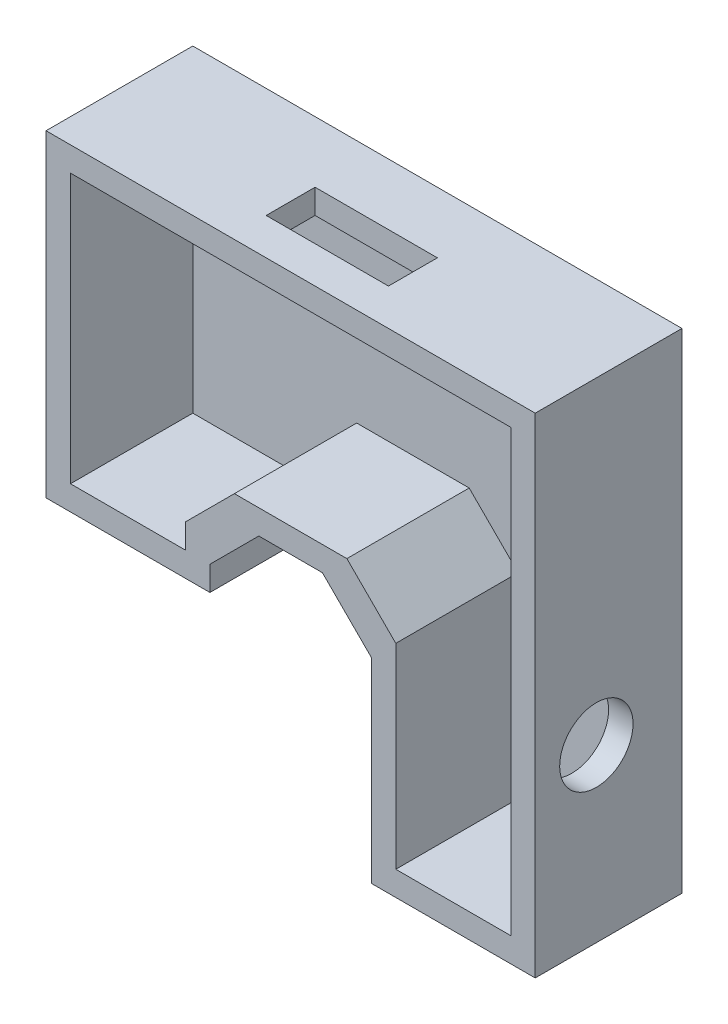
ISO-10303-21;
HEADER;
FILE_DESCRIPTION(('STEP AP214'),'2;1');
FILE_NAME('part.step','',(''),(''),'','','');
FILE_SCHEMA(('AUTOMOTIVE_DESIGN { 1 0 10303 214 1 1 1 1 }'));
ENDSEC;
DATA;
#1=APPLICATION_CONTEXT('core data for automotive mechanical design processes');
#2=APPLICATION_PROTOCOL_DEFINITION('international standard','automotive_design',2000,#1);
#3=PRODUCT_CONTEXT('',#1,'mechanical');
#4=PRODUCT('Part','Part','',(#3));
#5=PRODUCT_RELATED_PRODUCT_CATEGORY('part','',(#4));
#6=PRODUCT_DEFINITION_FORMATION('','',#4);
#7=PRODUCT_DEFINITION_CONTEXT('part definition',#1,'design');
#8=PRODUCT_DEFINITION('design','',#6,#7);
#9=PRODUCT_DEFINITION_SHAPE('','',#8);
#10=(LENGTH_UNIT() NAMED_UNIT(*) SI_UNIT(.MILLI.,.METRE.));
#11=(NAMED_UNIT(*) PLANE_ANGLE_UNIT() SI_UNIT($,.RADIAN.));
#12=(NAMED_UNIT(*) SI_UNIT($,.STERADIAN.) SOLID_ANGLE_UNIT());
#13=UNCERTAINTY_MEASURE_WITH_UNIT(LENGTH_MEASURE(1.E-05),#10,'distance_accuracy_value','');
#14=(GEOMETRIC_REPRESENTATION_CONTEXT(3) GLOBAL_UNCERTAINTY_ASSIGNED_CONTEXT((#13)) GLOBAL_UNIT_ASSIGNED_CONTEXT((#10,
#11,#12)) REPRESENTATION_CONTEXT('',''));
#15=CARTESIAN_POINT('',(0.,0.,0.));
#16=DIRECTION('',(0.,0.,1.));
#17=DIRECTION('',(1.,0.,0.));
#18=AXIS2_PLACEMENT_3D('',#15,#16,#17);
#19=CARTESIAN_POINT('',(0.,0.,12.5));
#20=DIRECTION('',(0.,0.,1.));
#21=DIRECTION('',(1.,0.,0.));
#22=AXIS2_PLACEMENT_3D('',#19,#20,#21);
#23=PLANE('',#22);
#24=DIRECTION('',(0.,-1.,0.));
#25=VECTOR('',#24,1.);
#26=CARTESIAN_POINT('',(-50.,-15.,12.5));
#27=LINE('',#26,#25);
#28=CARTESIAN_POINT('',(-50.,50.,12.5));
#29=VERTEX_POINT('',#28);
#30=CARTESIAN_POINT('',(-50.,-15.,12.5));
#31=VERTEX_POINT('',#30);
#32=EDGE_CURVE('E370',#29,#31,#27,.T.);
#33=ORIENTED_EDGE('',*,*,#32,.T.);
#34=DIRECTION('',(1.,0.,0.));
#35=VECTOR('',#34,1.);
#36=CARTESIAN_POINT('',(-50.,-15.,12.5));
#37=LINE('',#36,#35);
#38=CARTESIAN_POINT('',(-16.5,-15.,12.5));
#39=VERTEX_POINT('',#38);
#40=EDGE_CURVE('E374',#31,#39,#37,.T.);
#41=ORIENTED_EDGE('',*,*,#40,.T.);
#42=DIRECTION('',(0.,1.,0.));
#43=VECTOR('',#42,1.);
#44=CARTESIAN_POINT('',(-16.5,-15.,12.5));
#45=LINE('',#44,#43);
#46=CARTESIAN_POINT('',(-16.5,-9.99999999999995,12.5));
#47=VERTEX_POINT('',#46);
#48=EDGE_CURVE('E377',#39,#47,#45,.T.);
#49=ORIENTED_EDGE('',*,*,#48,.T.);
#50=DIRECTION('',(-0.707106781186551,-0.707106781186544,0.));
#51=VECTOR('',#50,1.);
#52=CARTESIAN_POINT('',(-6.49999999999993,0.,12.5));
#53=LINE('',#52,#51);
#54=CARTESIAN_POINT('',(-6.49999999999993,0.,12.5));
#55=VERTEX_POINT('',#54);
#56=EDGE_CURVE('E436',#47,#55,#53,.F.);
#57=ORIENTED_EDGE('',*,*,#56,.T.);
#58=DIRECTION('',(1.,0.,0.));
#59=VECTOR('',#58,1.);
#60=CARTESIAN_POINT('',(-16.5,0.,12.5));
#61=LINE('',#60,#59);
#62=CARTESIAN_POINT('',(6.50000000000007,0.,12.5));
#63=VERTEX_POINT('',#62);
#64=EDGE_CURVE('E381',#55,#63,#61,.T.);
#65=ORIENTED_EDGE('',*,*,#64,.T.);
#66=DIRECTION('',(-0.707106781186544,0.707106781186551,0.));
#67=VECTOR('',#66,1.);
#68=CARTESIAN_POINT('',(16.5000000000001,-10.0000000000001,12.5));
#69=LINE('',#68,#67);
#70=CARTESIAN_POINT('',(16.5,-10.0000000000001,12.5));
#71=VERTEX_POINT('',#70);
#72=EDGE_CURVE('E442',#63,#71,#69,.F.);
#73=ORIENTED_EDGE('',*,*,#72,.T.);
#74=DIRECTION('',(0.,-1.,0.));
#75=VECTOR('',#74,1.);
#76=CARTESIAN_POINT('',(16.5,-45.,12.5));
#77=LINE('',#76,#75);
#78=CARTESIAN_POINT('',(16.5,-50.,12.5));
#79=VERTEX_POINT('',#78);
#80=EDGE_CURVE('E385',#71,#79,#77,.T.);
#81=ORIENTED_EDGE('',*,*,#80,.T.);
#82=DIRECTION('',(1.,0.,0.));
#83=VECTOR('',#82,1.);
#84=CARTESIAN_POINT('',(50.,-50.,12.5));
#85=LINE('',#84,#83);
#86=CARTESIAN_POINT('',(50.,-50.,12.5));
#87=VERTEX_POINT('',#86);
#88=EDGE_CURVE('E388',#79,#87,#85,.T.);
#89=ORIENTED_EDGE('',*,*,#88,.T.);
#90=DIRECTION('',(0.,1.,0.));
#91=VECTOR('',#90,1.);
#92=CARTESIAN_POINT('',(50.,-50.,12.5));
#93=LINE('',#92,#91);
#94=CARTESIAN_POINT('',(50.,50.,12.5));
#95=VERTEX_POINT('',#94);
#96=EDGE_CURVE('E391',#87,#95,#93,.T.);
#97=ORIENTED_EDGE('',*,*,#96,.T.);
#98=DIRECTION('',(-1.,0.,0.));
#99=VECTOR('',#98,1.);
#100=CARTESIAN_POINT('',(50.,50.,12.5));
#101=LINE('',#100,#99);
#102=EDGE_CURVE('E394',#95,#29,#101,.T.);
#103=ORIENTED_EDGE('',*,*,#102,.T.);
#104=EDGE_LOOP('',(#33,#41,#49,#57,#65,#73,#81,#89,#97,#103));
#105=FACE_BOUND('',#104,.T.);
#106=DIRECTION('',(0.,-1.,0.));
#107=VECTOR('',#106,1.);
#108=CARTESIAN_POINT('',(21.5,-45.,12.5));
#109=LINE('',#108,#107);
#110=CARTESIAN_POINT('',(21.5,-5.00000000000005,12.5));
#111=VERTEX_POINT('',#110);
#112=CARTESIAN_POINT('',(21.5,-45.,12.5));
#113=VERTEX_POINT('',#112);
#114=EDGE_CURVE('E318',#111,#113,#109,.T.);
#115=ORIENTED_EDGE('',*,*,#114,.F.);
#116=DIRECTION('',(0.707106781186546,-0.707106781186549,0.));
#117=VECTOR('',#116,1.);
#118=CARTESIAN_POINT('',(8.25000000000003,8.25,12.5));
#119=LINE('',#118,#117);
#120=CARTESIAN_POINT('',(11.5,5.,12.5));
#121=VERTEX_POINT('',#120);
#122=EDGE_CURVE('E457',#111,#121,#119,.F.);
#123=ORIENTED_EDGE('',*,*,#122,.T.);
#124=DIRECTION('',(1.,0.,0.));
#125=VECTOR('',#124,1.);
#126=CARTESIAN_POINT('',(21.5,5.,12.5));
#127=LINE('',#126,#125);
#128=CARTESIAN_POINT('',(-11.5,5.,12.5));
#129=VERTEX_POINT('',#128);
#130=EDGE_CURVE('E314',#129,#121,#127,.T.);
#131=ORIENTED_EDGE('',*,*,#130,.F.);
#132=DIRECTION('',(0.707106781186549,0.707106781186546,0.));
#133=VECTOR('',#132,1.);
#134=CARTESIAN_POINT('',(-8.24999999999996,8.24999999999998,12.5));
#135=LINE('',#134,#133);
#136=CARTESIAN_POINT('',(-21.5,-5.00000000000001,12.5));
#137=VERTEX_POINT('',#136);
#138=EDGE_CURVE('E64',#129,#137,#135,.F.);
#139=ORIENTED_EDGE('',*,*,#138,.T.);
#140=DIRECTION('',(0.,1.,0.));
#141=VECTOR('',#140,1.);
#142=CARTESIAN_POINT('',(-21.5,-10.,12.5));
#143=LINE('',#142,#141);
#144=CARTESIAN_POINT('',(-21.5,-10.,12.5));
#145=VERTEX_POINT('',#144);
#146=EDGE_CURVE('E311',#145,#137,#143,.T.);
#147=ORIENTED_EDGE('',*,*,#146,.F.);
#148=DIRECTION('',(1.,0.,0.));
#149=VECTOR('',#148,1.);
#150=CARTESIAN_POINT('',(-21.5,-10.,12.5));
#151=LINE('',#150,#149);
#152=CARTESIAN_POINT('',(-45.,-10.,12.5));
#153=VERTEX_POINT('',#152);
#154=EDGE_CURVE('E308',#153,#145,#151,.T.);
#155=ORIENTED_EDGE('',*,*,#154,.F.);
#156=DIRECTION('',(0.,-1.,0.));
#157=VECTOR('',#156,1.);
#158=CARTESIAN_POINT('',(-45.,-10.,12.5));
#159=LINE('',#158,#157);
#160=CARTESIAN_POINT('',(-45.,45.,12.5));
#161=VERTEX_POINT('',#160);
#162=EDGE_CURVE('E305',#161,#153,#159,.T.);
#163=ORIENTED_EDGE('',*,*,#162,.F.);
#164=DIRECTION('',(-1.,0.,0.));
#165=VECTOR('',#164,1.);
#166=CARTESIAN_POINT('',(45.,45.,12.5));
#167=LINE('',#166,#165);
#168=CARTESIAN_POINT('',(45.,45.,12.5));
#169=VERTEX_POINT('',#168);
#170=EDGE_CURVE('E302',#169,#161,#167,.T.);
#171=ORIENTED_EDGE('',*,*,#170,.F.);
#172=DIRECTION('',(0.,1.,0.));
#173=VECTOR('',#172,1.);
#174=CARTESIAN_POINT('',(45.,-45.,12.5));
#175=LINE('',#174,#173);
#176=CARTESIAN_POINT('',(45.,-45.,12.5));
#177=VERTEX_POINT('',#176);
#178=EDGE_CURVE('E298',#177,#169,#175,.T.);
#179=ORIENTED_EDGE('',*,*,#178,.F.);
#180=DIRECTION('',(1.,0.,0.));
#181=VECTOR('',#180,1.);
#182=CARTESIAN_POINT('',(45.,-45.,12.5));
#183=LINE('',#182,#181);
#184=EDGE_CURVE('E295',#113,#177,#183,.T.);
#185=ORIENTED_EDGE('',*,*,#184,.F.);
#186=EDGE_LOOP('',(#115,#123,#131,#139,#147,#155,#163,#171,#179,#185));
#187=FACE_BOUND('',#186,.T.);
#188=ADVANCED_FACE('F41',(#105,#187),#23,.T.);
#189=CARTESIAN_POINT('',(-50.,-15.,12.5));
#190=DIRECTION('',(1.,0.,0.));
#191=DIRECTION('',(0.,0.,-1.));
#192=AXIS2_PLACEMENT_3D('',#189,#190,#191);
#193=PLANE('',#192);
#194=DIRECTION('',(0.,0.,-1.));
#195=VECTOR('',#194,1.);
#196=CARTESIAN_POINT('',(-50.,50.,12.5));
#197=LINE('',#196,#195);
#198=CARTESIAN_POINT('',(-50.,50.,-17.5));
#199=VERTEX_POINT('',#198);
#200=EDGE_CURVE('E397',#29,#199,#197,.T.);
#201=ORIENTED_EDGE('',*,*,#200,.T.);
#202=DIRECTION('',(0.,1.,0.));
#203=VECTOR('',#202,1.);
#204=CARTESIAN_POINT('',(-50.,50.,-17.5));
#205=LINE('',#204,#203);
#206=CARTESIAN_POINT('',(-50.,-15.,-17.5));
#207=VERTEX_POINT('',#206);
#208=EDGE_CURVE('E267',#207,#199,#205,.T.);
#209=ORIENTED_EDGE('',*,*,#208,.F.);
#210=DIRECTION('',(0.,0.,-1.));
#211=VECTOR('',#210,1.);
#212=CARTESIAN_POINT('',(-50.,-15.,12.5));
#213=LINE('',#212,#211);
#214=EDGE_CURVE('E413',#31,#207,#213,.T.);
#215=ORIENTED_EDGE('',*,*,#214,.F.);
#216=ORIENTED_EDGE('',*,*,#32,.F.);
#217=EDGE_LOOP('',(#201,#209,#215,#216));
#218=FACE_BOUND('',#217,.T.);
#219=ADVANCED_FACE('F517',(#218),#193,.F.);
#220=CARTESIAN_POINT('',(-50.,-15.,12.5));
#221=DIRECTION('',(0.,1.,0.));
#222=DIRECTION('',(0.,0.,1.));
#223=AXIS2_PLACEMENT_3D('',#220,#221,#222);
#224=PLANE('',#223);
#225=ORIENTED_EDGE('',*,*,#214,.T.);
#226=DIRECTION('',(-1.,0.,0.));
#227=VECTOR('',#226,1.);
#228=CARTESIAN_POINT('',(-16.5,-15.,-17.5));
#229=LINE('',#228,#227);
#230=CARTESIAN_POINT('',(-16.5,-15.,-17.5));
#231=VERTEX_POINT('',#230);
#232=EDGE_CURVE('E258',#231,#207,#229,.T.);
#233=ORIENTED_EDGE('',*,*,#232,.F.);
#234=DIRECTION('',(0.,0.,-1.));
#235=VECTOR('',#234,1.);
#236=CARTESIAN_POINT('',(-16.5,-15.,12.5));
#237=LINE('',#236,#235);
#238=EDGE_CURVE('E409',#39,#231,#237,.T.);
#239=ORIENTED_EDGE('',*,*,#238,.F.);
#240=ORIENTED_EDGE('',*,*,#40,.F.);
#241=EDGE_LOOP('',(#225,#233,#239,#240));
#242=FACE_BOUND('',#241,.T.);
#243=ADVANCED_FACE('F522',(#242),#224,.F.);
#244=CARTESIAN_POINT('',(-16.5,-15.,12.5));
#245=DIRECTION('',(-1.,0.,0.));
#246=DIRECTION('',(0.,-1.,0.));
#247=AXIS2_PLACEMENT_3D('',#244,#245,#246);
#248=PLANE('',#247);
#249=DIRECTION('',(0.,-1.,0.));
#250=VECTOR('',#249,1.);
#251=CARTESIAN_POINT('',(-16.5,0.,-17.5));
#252=LINE('',#251,#250);
#253=CARTESIAN_POINT('',(-16.5,-9.99999999999995,-17.5));
#254=VERTEX_POINT('',#253);
#255=EDGE_CURVE('E291',#254,#231,#252,.T.);
#256=ORIENTED_EDGE('',*,*,#255,.F.);
#257=DIRECTION('',(0.,0.,1.));
#258=VECTOR('',#257,1.);
#259=CARTESIAN_POINT('',(-16.5,-9.99999999999995,12.5));
#260=LINE('',#259,#258);
#261=EDGE_CURVE('E426',#254,#47,#260,.T.);
#262=ORIENTED_EDGE('',*,*,#261,.T.);
#263=ORIENTED_EDGE('',*,*,#48,.F.);
#264=ORIENTED_EDGE('',*,*,#238,.T.);
#265=EDGE_LOOP('',(#256,#262,#263,#264));
#266=FACE_BOUND('',#265,.T.);
#267=ADVANCED_FACE('F540',(#266),#248,.F.);
#268=CARTESIAN_POINT('',(-16.5,0.,12.5));
#269=DIRECTION('',(0.,1.,0.));
#270=DIRECTION('',(0.,0.,1.));
#271=AXIS2_PLACEMENT_3D('',#268,#269,#270);
#272=PLANE('',#271);
#273=ORIENTED_EDGE('',*,*,#64,.F.);
#274=DIRECTION('',(0.,0.,-1.));
#275=VECTOR('',#274,1.);
#276=CARTESIAN_POINT('',(-6.49999999999993,0.,-17.5));
#277=LINE('',#276,#275);
#278=CARTESIAN_POINT('',(-6.49999999999993,0.,-17.5));
#279=VERTEX_POINT('',#278);
#280=EDGE_CURVE('E422',#55,#279,#277,.T.);
#281=ORIENTED_EDGE('',*,*,#280,.T.);
#282=DIRECTION('',(-1.,0.,0.));
#283=VECTOR('',#282,1.);
#284=CARTESIAN_POINT('',(16.5,0.,-17.5));
#285=LINE('',#284,#283);
#286=CARTESIAN_POINT('',(6.50000000000007,0.,-17.5));
#287=VERTEX_POINT('',#286);
#288=EDGE_CURVE('E287',#287,#279,#285,.T.);
#289=ORIENTED_EDGE('',*,*,#288,.F.);
#290=DIRECTION('',(0.,0.,1.));
#291=VECTOR('',#290,1.);
#292=CARTESIAN_POINT('',(6.50000000000007,0.,12.5));
#293=LINE('',#292,#291);
#294=EDGE_CURVE('E416',#287,#63,#293,.T.);
#295=ORIENTED_EDGE('',*,*,#294,.T.);
#296=EDGE_LOOP('',(#273,#281,#289,#295));
#297=FACE_BOUND('',#296,.T.);
#298=ADVANCED_FACE('F536',(#297),#272,.F.);
#299=CARTESIAN_POINT('',(16.5,-45.,12.5));
#300=DIRECTION('',(1.,0.,0.));
#301=DIRECTION('',(0.,1.,0.));
#302=AXIS2_PLACEMENT_3D('',#299,#300,#301);
#303=PLANE('',#302);
#304=ORIENTED_EDGE('',*,*,#80,.F.);
#305=DIRECTION('',(0.,0.,-1.));
#306=VECTOR('',#305,1.);
#307=CARTESIAN_POINT('',(16.5000000000001,-10.0000000000001,-17.5));
#308=LINE('',#307,#306);
#309=CARTESIAN_POINT('',(16.5,-10.0000000000001,-17.5));
#310=VERTEX_POINT('',#309);
#311=EDGE_CURVE('E429',#71,#310,#308,.T.);
#312=ORIENTED_EDGE('',*,*,#311,.T.);
#313=DIRECTION('',(0.,1.,0.));
#314=VECTOR('',#313,1.);
#315=CARTESIAN_POINT('',(16.5,0.,-17.5));
#316=LINE('',#315,#314);
#317=CARTESIAN_POINT('',(16.5,-50.,-17.5));
#318=VERTEX_POINT('',#317);
#319=EDGE_CURVE('E283',#318,#310,#316,.T.);
#320=ORIENTED_EDGE('',*,*,#319,.F.);
#321=DIRECTION('',(0.,0.,-1.));
#322=VECTOR('',#321,1.);
#323=CARTESIAN_POINT('',(16.5,-50.,12.5));
#324=LINE('',#323,#322);
#325=EDGE_CURVE('E406',#79,#318,#324,.T.);
#326=ORIENTED_EDGE('',*,*,#325,.F.);
#327=EDGE_LOOP('',(#304,#312,#320,#326));
#328=FACE_BOUND('',#327,.T.);
#329=ADVANCED_FACE('F532',(#328),#303,.F.);
#330=CARTESIAN_POINT('',(50.,-50.,12.5));
#331=DIRECTION('',(0.,1.,0.));
#332=DIRECTION('',(0.,0.,1.));
#333=AXIS2_PLACEMENT_3D('',#330,#331,#332);
#334=PLANE('',#333);
#335=ORIENTED_EDGE('',*,*,#325,.T.);
#336=DIRECTION('',(-1.,0.,0.));
#337=VECTOR('',#336,1.);
#338=CARTESIAN_POINT('',(16.5,-50.,-17.5));
#339=LINE('',#338,#337);
#340=CARTESIAN_POINT('',(50.,-50.,-17.5));
#341=VERTEX_POINT('',#340);
#342=EDGE_CURVE('E279',#341,#318,#339,.T.);
#343=ORIENTED_EDGE('',*,*,#342,.F.);
#344=DIRECTION('',(0.,0.,-1.));
#345=VECTOR('',#344,1.);
#346=CARTESIAN_POINT('',(50.,-50.,12.5));
#347=LINE('',#346,#345);
#348=EDGE_CURVE('E403',#87,#341,#347,.T.);
#349=ORIENTED_EDGE('',*,*,#348,.F.);
#350=ORIENTED_EDGE('',*,*,#88,.F.);
#351=EDGE_LOOP('',(#335,#343,#349,#350));
#352=FACE_BOUND('',#351,.T.);
#353=ADVANCED_FACE('F528',(#352),#334,.F.);
#354=CARTESIAN_POINT('',(50.,-50.,12.5));
#355=DIRECTION('',(-1.,0.,0.));
#356=DIRECTION('',(0.,-1.,0.));
#357=AXIS2_PLACEMENT_3D('',#354,#355,#356);
#358=PLANE('',#357);
#359=CARTESIAN_POINT('',(50.,-15.,0.));
#360=DIRECTION('',(1.,0.,0.));
#361=DIRECTION('',(0.,1.,0.));
#362=AXIS2_PLACEMENT_3D('',#359,#360,#361);
#363=CIRCLE('',#362,7.5);
#364=CARTESIAN_POINT('',(50.,-7.50000000000001,0.));
#365=VERTEX_POINT('',#364);
#366=EDGE_CURVE('E240',#365,#365,#363,.T.);
#367=ORIENTED_EDGE('',*,*,#366,.F.);
#368=EDGE_LOOP('',(#367));
#369=FACE_BOUND('',#368,.T.);
#370=ORIENTED_EDGE('',*,*,#348,.T.);
#371=DIRECTION('',(0.,-1.,0.));
#372=VECTOR('',#371,1.);
#373=CARTESIAN_POINT('',(50.,-50.,-17.5));
#374=LINE('',#373,#372);
#375=CARTESIAN_POINT('',(50.,50.,-17.5));
#376=VERTEX_POINT('',#375);
#377=EDGE_CURVE('E275',#376,#341,#374,.T.);
#378=ORIENTED_EDGE('',*,*,#377,.F.);
#379=DIRECTION('',(0.,0.,-1.));
#380=VECTOR('',#379,1.);
#381=CARTESIAN_POINT('',(50.,50.,12.5));
#382=LINE('',#381,#380);
#383=EDGE_CURVE('E400',#95,#376,#382,.T.);
#384=ORIENTED_EDGE('',*,*,#383,.F.);
#385=ORIENTED_EDGE('',*,*,#96,.F.);
#386=EDGE_LOOP('',(#370,#378,#384,#385));
#387=FACE_BOUND('',#386,.T.);
#388=ADVANCED_FACE('F513',(#369,#387),#358,.F.);
#389=CARTESIAN_POINT('',(50.,50.,12.5));
#390=DIRECTION('',(0.,-1.,0.));
#391=DIRECTION('',(1.,0.,0.));
#392=AXIS2_PLACEMENT_3D('',#389,#390,#391);
#393=PLANE('',#392);
#394=DIRECTION('',(1.,0.,0.));
#395=VECTOR('',#394,1.);
#396=CARTESIAN_POINT('',(-12.5,50.,-5.));
#397=LINE('',#396,#395);
#398=CARTESIAN_POINT('',(-12.5,50.,-5.));
#399=VERTEX_POINT('',#398);
#400=CARTESIAN_POINT('',(12.5,50.,-5.));
#401=VERTEX_POINT('',#400);
#402=EDGE_CURVE('E218',#399,#401,#397,.T.);
#403=ORIENTED_EDGE('',*,*,#402,.T.);
#404=DIRECTION('',(0.,0.,1.));
#405=VECTOR('',#404,1.);
#406=CARTESIAN_POINT('',(12.5,50.,-5.));
#407=LINE('',#406,#405);
#408=CARTESIAN_POINT('',(12.5,50.,5.));
#409=VERTEX_POINT('',#408);
#410=EDGE_CURVE('E209',#401,#409,#407,.T.);
#411=ORIENTED_EDGE('',*,*,#410,.T.);
#412=DIRECTION('',(-1.,0.,0.));
#413=VECTOR('',#412,1.);
#414=CARTESIAN_POINT('',(-12.5,50.,5.));
#415=LINE('',#414,#413);
#416=CARTESIAN_POINT('',(-12.5,50.,5.));
#417=VERTEX_POINT('',#416);
#418=EDGE_CURVE('E222',#409,#417,#415,.T.);
#419=ORIENTED_EDGE('',*,*,#418,.T.);
#420=DIRECTION('',(0.,0.,-1.));
#421=VECTOR('',#420,1.);
#422=CARTESIAN_POINT('',(-12.5,50.,-5.));
#423=LINE('',#422,#421);
#424=EDGE_CURVE('E227',#417,#399,#423,.T.);
#425=ORIENTED_EDGE('',*,*,#424,.T.);
#426=EDGE_LOOP('',(#403,#411,#419,#425));
#427=FACE_BOUND('',#426,.T.);
#428=ORIENTED_EDGE('',*,*,#383,.T.);
#429=DIRECTION('',(1.,0.,0.));
#430=VECTOR('',#429,1.);
#431=CARTESIAN_POINT('',(50.,50.,-17.5));
#432=LINE('',#431,#430);
#433=EDGE_CURVE('E271',#199,#376,#432,.T.);
#434=ORIENTED_EDGE('',*,*,#433,.F.);
#435=ORIENTED_EDGE('',*,*,#200,.F.);
#436=ORIENTED_EDGE('',*,*,#102,.F.);
#437=EDGE_LOOP('',(#428,#434,#435,#436));
#438=FACE_BOUND('',#437,.T.);
#439=ADVANCED_FACE('F229',(#427,#438),#393,.F.);
#440=CARTESIAN_POINT('',(45.,-45.,12.5));
#441=DIRECTION('',(0.,1.,0.));
#442=DIRECTION('',(-1.,0.,0.));
#443=AXIS2_PLACEMENT_3D('',#440,#441,#442);
#444=PLANE('',#443);
#445=DIRECTION('',(1.,0.,0.));
#446=VECTOR('',#445,1.);
#447=CARTESIAN_POINT('',(45.,-45.,-12.5));
#448=LINE('',#447,#446);
#449=CARTESIAN_POINT('',(21.5,-45.,-12.5));
#450=VERTEX_POINT('',#449);
#451=CARTESIAN_POINT('',(45.,-45.,-12.5));
#452=VERTEX_POINT('',#451);
#453=EDGE_CURVE('E294',#450,#452,#448,.T.);
#454=ORIENTED_EDGE('',*,*,#453,.F.);
#455=DIRECTION('',(0.,0.,-1.));
#456=VECTOR('',#455,1.);
#457=CARTESIAN_POINT('',(21.5,-45.,12.5));
#458=LINE('',#457,#456);
#459=EDGE_CURVE('E321',#113,#450,#458,.T.);
#460=ORIENTED_EDGE('',*,*,#459,.F.);
#461=ORIENTED_EDGE('',*,*,#184,.T.);
#462=DIRECTION('',(0.,0.,-1.));
#463=VECTOR('',#462,1.);
#464=CARTESIAN_POINT('',(45.,-45.,12.5));
#465=LINE('',#464,#463);
#466=EDGE_CURVE('E366',#177,#452,#465,.T.);
#467=ORIENTED_EDGE('',*,*,#466,.T.);
#468=EDGE_LOOP('',(#454,#460,#461,#467));
#469=FACE_BOUND('',#468,.T.);
#470=ADVANCED_FACE('F504',(#469),#444,.T.);
#471=CARTESIAN_POINT('',(45.,-45.,12.5));
#472=DIRECTION('',(-1.,0.,0.));
#473=DIRECTION('',(0.,-1.,0.));
#474=AXIS2_PLACEMENT_3D('',#471,#472,#473);
#475=PLANE('',#474);
#476=CARTESIAN_POINT('',(45.,-15.,0.));
#477=DIRECTION('',(-1.,0.,0.));
#478=DIRECTION('',(0.,-1.,0.));
#479=AXIS2_PLACEMENT_3D('',#476,#477,#478);
#480=CIRCLE('',#479,7.5);
#481=CARTESIAN_POINT('',(45.,-22.5,0.));
#482=VERTEX_POINT('',#481);
#483=EDGE_CURVE('E249',#482,#482,#480,.T.);
#484=ORIENTED_EDGE('',*,*,#483,.F.);
#485=EDGE_LOOP('',(#484));
#486=FACE_BOUND('',#485,.T.);
#487=DIRECTION('',(0.,1.,0.));
#488=VECTOR('',#487,1.);
#489=CARTESIAN_POINT('',(45.,-45.,-12.5));
#490=LINE('',#489,#488);
#491=CARTESIAN_POINT('',(45.,45.,-12.5));
#492=VERTEX_POINT('',#491);
#493=EDGE_CURVE('E325',#452,#492,#490,.T.);
#494=ORIENTED_EDGE('',*,*,#493,.F.);
#495=ORIENTED_EDGE('',*,*,#466,.F.);
#496=ORIENTED_EDGE('',*,*,#178,.T.);
#497=DIRECTION('',(0.,0.,-1.));
#498=VECTOR('',#497,1.);
#499=CARTESIAN_POINT('',(45.,45.,12.5));
#500=LINE('',#499,#498);
#501=EDGE_CURVE('E363',#169,#492,#500,.T.);
#502=ORIENTED_EDGE('',*,*,#501,.T.);
#503=EDGE_LOOP('',(#494,#495,#496,#502));
#504=FACE_BOUND('',#503,.T.);
#505=ADVANCED_FACE('F501',(#486,#504),#475,.T.);
#506=CARTESIAN_POINT('',(45.,45.,12.5));
#507=DIRECTION('',(0.,-1.,0.));
#508=DIRECTION('',(0.,0.,-1.));
#509=AXIS2_PLACEMENT_3D('',#506,#507,#508);
#510=PLANE('',#509);
#511=DIRECTION('',(0.,0.,1.));
#512=VECTOR('',#511,1.);
#513=CARTESIAN_POINT('',(12.5,45.,-5.));
#514=LINE('',#513,#512);
#515=CARTESIAN_POINT('',(12.5,45.,-5.));
#516=VERTEX_POINT('',#515);
#517=CARTESIAN_POINT('',(12.5,45.,5.));
#518=VERTEX_POINT('',#517);
#519=EDGE_CURVE('E212',#516,#518,#514,.T.);
#520=ORIENTED_EDGE('',*,*,#519,.F.);
#521=DIRECTION('',(1.,0.,0.));
#522=VECTOR('',#521,1.);
#523=CARTESIAN_POINT('',(-12.5,45.,-5.));
#524=LINE('',#523,#522);
#525=CARTESIAN_POINT('',(-12.5,45.,-5.));
#526=VERTEX_POINT('',#525);
#527=EDGE_CURVE('E233',#526,#516,#524,.T.);
#528=ORIENTED_EDGE('',*,*,#527,.F.);
#529=DIRECTION('',(0.,0.,-1.));
#530=VECTOR('',#529,1.);
#531=CARTESIAN_POINT('',(-12.5,45.,-5.));
#532=LINE('',#531,#530);
#533=CARTESIAN_POINT('',(-12.5,45.,5.));
#534=VERTEX_POINT('',#533);
#535=EDGE_CURVE('E237',#534,#526,#532,.T.);
#536=ORIENTED_EDGE('',*,*,#535,.F.);
#537=DIRECTION('',(-1.,0.,0.));
#538=VECTOR('',#537,1.);
#539=CARTESIAN_POINT('',(-12.5,45.,5.));
#540=LINE('',#539,#538);
#541=EDGE_CURVE('E248',#518,#534,#540,.T.);
#542=ORIENTED_EDGE('',*,*,#541,.F.);
#543=EDGE_LOOP('',(#520,#528,#536,#542));
#544=FACE_BOUND('',#543,.T.);
#545=DIRECTION('',(-1.,0.,0.));
#546=VECTOR('',#545,1.);
#547=CARTESIAN_POINT('',(45.,45.,-12.5));
#548=LINE('',#547,#546);
#549=CARTESIAN_POINT('',(-45.,45.,-12.5));
#550=VERTEX_POINT('',#549);
#551=EDGE_CURVE('E329',#492,#550,#548,.T.);
#552=ORIENTED_EDGE('',*,*,#551,.F.);
#553=ORIENTED_EDGE('',*,*,#501,.F.);
#554=ORIENTED_EDGE('',*,*,#170,.T.);
#555=DIRECTION('',(0.,0.,-1.));
#556=VECTOR('',#555,1.);
#557=CARTESIAN_POINT('',(-45.,45.,12.5));
#558=LINE('',#557,#556);
#559=EDGE_CURVE('E360',#161,#550,#558,.T.);
#560=ORIENTED_EDGE('',*,*,#559,.T.);
#561=EDGE_LOOP('',(#552,#553,#554,#560));
#562=FACE_BOUND('',#561,.T.);
#563=ADVANCED_FACE('F498',(#544,#562),#510,.T.);
#564=CARTESIAN_POINT('',(-45.,-10.,12.5));
#565=DIRECTION('',(1.,0.,0.));
#566=DIRECTION('',(0.,0.,-1.));
#567=AXIS2_PLACEMENT_3D('',#564,#565,#566);
#568=PLANE('',#567);
#569=DIRECTION('',(0.,-1.,0.));
#570=VECTOR('',#569,1.);
#571=CARTESIAN_POINT('',(-45.,-10.,-12.5));
#572=LINE('',#571,#570);
#573=CARTESIAN_POINT('',(-45.,-10.,-12.5));
#574=VERTEX_POINT('',#573);
#575=EDGE_CURVE('E333',#550,#574,#572,.T.);
#576=ORIENTED_EDGE('',*,*,#575,.F.);
#577=ORIENTED_EDGE('',*,*,#559,.F.);
#578=ORIENTED_EDGE('',*,*,#162,.T.);
#579=DIRECTION('',(0.,0.,-1.));
#580=VECTOR('',#579,1.);
#581=CARTESIAN_POINT('',(-45.,-10.,12.5));
#582=LINE('',#581,#580);
#583=EDGE_CURVE('E357',#153,#574,#582,.T.);
#584=ORIENTED_EDGE('',*,*,#583,.T.);
#585=EDGE_LOOP('',(#576,#577,#578,#584));
#586=FACE_BOUND('',#585,.T.);
#587=ADVANCED_FACE('F495',(#586),#568,.T.);
#588=CARTESIAN_POINT('',(-21.5,-10.,12.5));
#589=DIRECTION('',(0.,1.,0.));
#590=DIRECTION('',(-1.,0.,0.));
#591=AXIS2_PLACEMENT_3D('',#588,#589,#590);
#592=PLANE('',#591);
#593=DIRECTION('',(1.,0.,0.));
#594=VECTOR('',#593,1.);
#595=CARTESIAN_POINT('',(-21.5,-10.,-12.5));
#596=LINE('',#595,#594);
#597=CARTESIAN_POINT('',(-21.5,-10.,-12.5));
#598=VERTEX_POINT('',#597);
#599=EDGE_CURVE('E337',#574,#598,#596,.T.);
#600=ORIENTED_EDGE('',*,*,#599,.F.);
#601=ORIENTED_EDGE('',*,*,#583,.F.);
#602=ORIENTED_EDGE('',*,*,#154,.T.);
#603=DIRECTION('',(0.,0.,-1.));
#604=VECTOR('',#603,1.);
#605=CARTESIAN_POINT('',(-21.5,-10.,12.5));
#606=LINE('',#605,#604);
#607=EDGE_CURVE('E354',#145,#598,#606,.T.);
#608=ORIENTED_EDGE('',*,*,#607,.T.);
#609=EDGE_LOOP('',(#600,#601,#602,#608));
#610=FACE_BOUND('',#609,.T.);
#611=ADVANCED_FACE('F488',(#610),#592,.T.);
#612=CARTESIAN_POINT('',(-21.5,-10.,12.5));
#613=DIRECTION('',(-1.,0.,0.));
#614=DIRECTION('',(0.,-1.,0.));
#615=AXIS2_PLACEMENT_3D('',#612,#613,#614);
#616=PLANE('',#615);
#617=ORIENTED_EDGE('',*,*,#146,.T.);
#618=DIRECTION('',(0.,0.,-1.));
#619=VECTOR('',#618,1.);
#620=CARTESIAN_POINT('',(-21.5,-5.00000000000001,12.5));
#621=LINE('',#620,#619);
#622=CARTESIAN_POINT('',(-21.5,-5.00000000000001,-12.5));
#623=VERTEX_POINT('',#622);
#624=EDGE_CURVE('E460',#137,#623,#621,.T.);
#625=ORIENTED_EDGE('',*,*,#624,.T.);
#626=DIRECTION('',(0.,1.,0.));
#627=VECTOR('',#626,1.);
#628=CARTESIAN_POINT('',(-21.5,-10.,-12.5));
#629=LINE('',#628,#627);
#630=EDGE_CURVE('E341',#598,#623,#629,.T.);
#631=ORIENTED_EDGE('',*,*,#630,.F.);
#632=ORIENTED_EDGE('',*,*,#607,.F.);
#633=EDGE_LOOP('',(#617,#625,#631,#632));
#634=FACE_BOUND('',#633,.T.);
#635=ADVANCED_FACE('F482',(#634),#616,.T.);
#636=CARTESIAN_POINT('',(21.5,5.,12.5));
#637=DIRECTION('',(0.,1.,0.));
#638=DIRECTION('',(0.,0.,1.));
#639=AXIS2_PLACEMENT_3D('',#636,#637,#638);
#640=PLANE('',#639);
#641=ORIENTED_EDGE('',*,*,#130,.T.);
#642=DIRECTION('',(0.,0.,-1.));
#643=VECTOR('',#642,1.);
#644=CARTESIAN_POINT('',(11.5,5.,12.5));
#645=LINE('',#644,#643);
#646=CARTESIAN_POINT('',(11.5,5.,-12.5));
#647=VERTEX_POINT('',#646);
#648=EDGE_CURVE('E448',#121,#647,#645,.T.);
#649=ORIENTED_EDGE('',*,*,#648,.T.);
#650=DIRECTION('',(1.,0.,0.));
#651=VECTOR('',#650,1.);
#652=CARTESIAN_POINT('',(21.5,5.,-12.5));
#653=LINE('',#652,#651);
#654=CARTESIAN_POINT('',(-11.5,5.,-12.5));
#655=VERTEX_POINT('',#654);
#656=EDGE_CURVE('E345',#655,#647,#653,.T.);
#657=ORIENTED_EDGE('',*,*,#656,.F.);
#658=DIRECTION('',(0.,0.,1.));
#659=VECTOR('',#658,1.);
#660=CARTESIAN_POINT('',(-11.5,5.,12.5));
#661=LINE('',#660,#659);
#662=EDGE_CURVE('E445',#655,#129,#661,.T.);
#663=ORIENTED_EDGE('',*,*,#662,.T.);
#664=EDGE_LOOP('',(#641,#649,#657,#663));
#665=FACE_BOUND('',#664,.T.);
#666=ADVANCED_FACE('F479',(#665),#640,.T.);
#667=CARTESIAN_POINT('',(21.5,-45.,12.5));
#668=DIRECTION('',(1.,0.,0.));
#669=DIRECTION('',(0.,0.,-1.));
#670=AXIS2_PLACEMENT_3D('',#667,#668,#669);
#671=PLANE('',#670);
#672=DIRECTION('',(0.,-1.,0.));
#673=VECTOR('',#672,1.);
#674=CARTESIAN_POINT('',(21.5,-45.,-12.5));
#675=LINE('',#674,#673);
#676=CARTESIAN_POINT('',(21.5,-5.00000000000005,-12.5));
#677=VERTEX_POINT('',#676);
#678=EDGE_CURVE('E299',#677,#450,#675,.T.);
#679=ORIENTED_EDGE('',*,*,#678,.F.);
#680=DIRECTION('',(0.,0.,1.));
#681=VECTOR('',#680,1.);
#682=CARTESIAN_POINT('',(21.5,-5.00000000000004,12.5));
#683=LINE('',#682,#681);
#684=EDGE_CURVE('E452',#677,#111,#683,.T.);
#685=ORIENTED_EDGE('',*,*,#684,.T.);
#686=ORIENTED_EDGE('',*,*,#114,.T.);
#687=ORIENTED_EDGE('',*,*,#459,.T.);
#688=EDGE_LOOP('',(#679,#685,#686,#687));
#689=FACE_BOUND('',#688,.T.);
#690=ADVANCED_FACE('F471',(#689),#671,.T.);
#691=CARTESIAN_POINT('',(0.,0.,-12.5));
#692=DIRECTION('',(0.,0.,1.));
#693=DIRECTION('',(1.,0.,0.));
#694=AXIS2_PLACEMENT_3D('',#691,#692,#693);
#695=PLANE('',#694);
#696=ORIENTED_EDGE('',*,*,#656,.T.);
#697=DIRECTION('',(-0.707106781186546,0.707106781186549,0.));
#698=VECTOR('',#697,1.);
#699=CARTESIAN_POINT('',(11.5,5.,-12.5));
#700=LINE('',#699,#698);
#701=EDGE_CURVE('E51',#647,#677,#700,.F.);
#702=ORIENTED_EDGE('',*,*,#701,.T.);
#703=ORIENTED_EDGE('',*,*,#678,.T.);
#704=ORIENTED_EDGE('',*,*,#453,.T.);
#705=ORIENTED_EDGE('',*,*,#493,.T.);
#706=ORIENTED_EDGE('',*,*,#551,.T.);
#707=ORIENTED_EDGE('',*,*,#575,.T.);
#708=ORIENTED_EDGE('',*,*,#599,.T.);
#709=ORIENTED_EDGE('',*,*,#630,.T.);
#710=DIRECTION('',(-0.707106781186549,-0.707106781186546,0.));
#711=VECTOR('',#710,1.);
#712=CARTESIAN_POINT('',(-21.5,-5.00000000000001,-12.5));
#713=LINE('',#712,#711);
#714=EDGE_CURVE('E11',#623,#655,#713,.F.);
#715=ORIENTED_EDGE('',*,*,#714,.T.);
#716=EDGE_LOOP('',(#696,#702,#703,#704,#705,#706,#707,#708,#709,#715));
#717=FACE_BOUND('',#716,.T.);
#718=ADVANCED_FACE('F465',(#717),#695,.T.);
#719=CARTESIAN_POINT('',(0.,0.,-17.5));
#720=DIRECTION('',(0.,0.,1.));
#721=DIRECTION('',(1.,0.,0.));
#722=AXIS2_PLACEMENT_3D('',#719,#720,#721);
#723=PLANE('',#722);
#724=ORIENTED_EDGE('',*,*,#232,.T.);
#725=ORIENTED_EDGE('',*,*,#208,.T.);
#726=ORIENTED_EDGE('',*,*,#433,.T.);
#727=ORIENTED_EDGE('',*,*,#377,.T.);
#728=ORIENTED_EDGE('',*,*,#342,.T.);
#729=ORIENTED_EDGE('',*,*,#319,.T.);
#730=DIRECTION('',(0.707106781186544,-0.707106781186551,0.));
#731=VECTOR('',#730,1.);
#732=CARTESIAN_POINT('',(3.25000000000007,3.25000000000003,-17.5));
#733=LINE('',#732,#731);
#734=EDGE_CURVE('E439',#310,#287,#733,.F.);
#735=ORIENTED_EDGE('',*,*,#734,.T.);
#736=ORIENTED_EDGE('',*,*,#288,.T.);
#737=DIRECTION('',(0.707106781186551,0.707106781186544,0.));
#738=VECTOR('',#737,1.);
#739=CARTESIAN_POINT('',(-3.24999999999993,3.24999999999996,-17.5));
#740=LINE('',#739,#738);
#741=EDGE_CURVE('E433',#279,#254,#740,.F.);
#742=ORIENTED_EDGE('',*,*,#741,.T.);
#743=ORIENTED_EDGE('',*,*,#255,.T.);
#744=EDGE_LOOP('',(#724,#725,#726,#727,#728,#729,#735,#736,#742,#743));
#745=FACE_BOUND('',#744,.T.);
#746=ADVANCED_FACE('F585',(#745),#723,.F.);
#747=CARTESIAN_POINT('',(12.5,50.,-5.));
#748=DIRECTION('',(1.,0.,0.));
#749=DIRECTION('',(0.,0.,-1.));
#750=AXIS2_PLACEMENT_3D('',#747,#748,#749);
#751=PLANE('',#750);
#752=ORIENTED_EDGE('',*,*,#519,.T.);
#753=DIRECTION('',(0.,-1.,0.));
#754=VECTOR('',#753,1.);
#755=CARTESIAN_POINT('',(12.5,50.,5.));
#756=LINE('',#755,#754);
#757=EDGE_CURVE('E205',#409,#518,#756,.T.);
#758=ORIENTED_EDGE('',*,*,#757,.F.);
#759=ORIENTED_EDGE('',*,*,#410,.F.);
#760=DIRECTION('',(0.,-1.,0.));
#761=VECTOR('',#760,1.);
#762=CARTESIAN_POINT('',(12.5,50.,-5.));
#763=LINE('',#762,#761);
#764=EDGE_CURVE('E255',#401,#516,#763,.T.);
#765=ORIENTED_EDGE('',*,*,#764,.T.);
#766=EDGE_LOOP('',(#752,#758,#759,#765));
#767=FACE_BOUND('',#766,.T.);
#768=ADVANCED_FACE('F207',(#767),#751,.F.);
#769=CARTESIAN_POINT('',(-12.5,50.,-5.));
#770=DIRECTION('',(0.,0.,-1.));
#771=DIRECTION('',(-1.,0.,0.));
#772=AXIS2_PLACEMENT_3D('',#769,#770,#771);
#773=PLANE('',#772);
#774=ORIENTED_EDGE('',*,*,#527,.T.);
#775=ORIENTED_EDGE('',*,*,#764,.F.);
#776=ORIENTED_EDGE('',*,*,#402,.F.);
#777=DIRECTION('',(0.,-1.,0.));
#778=VECTOR('',#777,1.);
#779=CARTESIAN_POINT('',(-12.5,50.,-5.));
#780=LINE('',#779,#778);
#781=EDGE_CURVE('E259',#399,#526,#780,.T.);
#782=ORIENTED_EDGE('',*,*,#781,.T.);
#783=EDGE_LOOP('',(#774,#775,#776,#782));
#784=FACE_BOUND('',#783,.T.);
#785=ADVANCED_FACE('F707',(#784),#773,.F.);
#786=CARTESIAN_POINT('',(-12.5,50.,-5.));
#787=DIRECTION('',(-1.,0.,0.));
#788=DIRECTION('',(0.,0.,1.));
#789=AXIS2_PLACEMENT_3D('',#786,#787,#788);
#790=PLANE('',#789);
#791=ORIENTED_EDGE('',*,*,#535,.T.);
#792=ORIENTED_EDGE('',*,*,#781,.F.);
#793=ORIENTED_EDGE('',*,*,#424,.F.);
#794=DIRECTION('',(0.,-1.,0.));
#795=VECTOR('',#794,1.);
#796=CARTESIAN_POINT('',(-12.5,50.,5.));
#797=LINE('',#796,#795);
#798=EDGE_CURVE('E217',#417,#534,#797,.T.);
#799=ORIENTED_EDGE('',*,*,#798,.T.);
#800=EDGE_LOOP('',(#791,#792,#793,#799));
#801=FACE_BOUND('',#800,.T.);
#802=ADVANCED_FACE('F698',(#801),#790,.F.);
#803=CARTESIAN_POINT('',(-12.5,50.,5.));
#804=DIRECTION('',(0.,0.,1.));
#805=DIRECTION('',(1.,0.,0.));
#806=AXIS2_PLACEMENT_3D('',#803,#804,#805);
#807=PLANE('',#806);
#808=ORIENTED_EDGE('',*,*,#541,.T.);
#809=ORIENTED_EDGE('',*,*,#798,.F.);
#810=ORIENTED_EDGE('',*,*,#418,.F.);
#811=ORIENTED_EDGE('',*,*,#757,.T.);
#812=EDGE_LOOP('',(#808,#809,#810,#811));
#813=FACE_BOUND('',#812,.T.);
#814=ADVANCED_FACE('F223',(#813),#807,.F.);
#815=CARTESIAN_POINT('',(40.,-15.,0.));
#816=DIRECTION('',(1.,0.,0.));
#817=DIRECTION('',(0.,1.,0.));
#818=AXIS2_PLACEMENT_3D('',#815,#816,#817);
#819=CYLINDRICAL_SURFACE('',#818,7.5);
#820=ORIENTED_EDGE('',*,*,#483,.T.);
#821=EDGE_LOOP('',(#820));
#822=FACE_BOUND('',#821,.T.);
#823=ORIENTED_EDGE('',*,*,#366,.T.);
#824=EDGE_LOOP('',(#823));
#825=FACE_BOUND('',#824,.T.);
#826=ADVANCED_FACE('F556',(#822,#825),#819,.F.);
#827=CARTESIAN_POINT('',(-6.49999999999993,0.,12.5));
#828=DIRECTION('',(0.707106781186544,-0.707106781186551,0.));
#829=DIRECTION('',(0.,0.,1.));
#830=AXIS2_PLACEMENT_3D('',#827,#828,#829);
#831=PLANE('',#830);
#832=ORIENTED_EDGE('',*,*,#56,.F.);
#833=ORIENTED_EDGE('',*,*,#261,.F.);
#834=ORIENTED_EDGE('',*,*,#741,.F.);
#835=ORIENTED_EDGE('',*,*,#280,.F.);
#836=EDGE_LOOP('',(#832,#833,#834,#835));
#837=FACE_BOUND('',#836,.T.);
#838=ADVANCED_FACE('F549',(#837),#831,.T.);
#839=CARTESIAN_POINT('',(16.5000000000001,-10.0000000000001,12.5));
#840=DIRECTION('',(-0.707106781186551,-0.707106781186544,0.));
#841=DIRECTION('',(0.,0.,1.));
#842=AXIS2_PLACEMENT_3D('',#839,#840,#841);
#843=PLANE('',#842);
#844=ORIENTED_EDGE('',*,*,#72,.F.);
#845=ORIENTED_EDGE('',*,*,#294,.F.);
#846=ORIENTED_EDGE('',*,*,#734,.F.);
#847=ORIENTED_EDGE('',*,*,#311,.F.);
#848=EDGE_LOOP('',(#844,#845,#846,#847));
#849=FACE_BOUND('',#848,.T.);
#850=ADVANCED_FACE('F555',(#849),#843,.T.);
#851=CARTESIAN_POINT('',(11.5,5.,12.5));
#852=DIRECTION('',(-0.707106781186549,-0.707106781186546,0.));
#853=DIRECTION('',(0.,0.,-1.));
#854=AXIS2_PLACEMENT_3D('',#851,#852,#853);
#855=PLANE('',#854);
#856=ORIENTED_EDGE('',*,*,#122,.F.);
#857=ORIENTED_EDGE('',*,*,#684,.F.);
#858=ORIENTED_EDGE('',*,*,#701,.F.);
#859=ORIENTED_EDGE('',*,*,#648,.F.);
#860=EDGE_LOOP('',(#856,#857,#858,#859));
#861=FACE_BOUND('',#860,.T.);
#862=ADVANCED_FACE('F476',(#861),#855,.F.);
#863=CARTESIAN_POINT('',(-21.5,-5.00000000000001,12.5));
#864=DIRECTION('',(0.707106781186546,-0.707106781186549,0.));
#865=DIRECTION('',(0.,0.,-1.));
#866=AXIS2_PLACEMENT_3D('',#863,#864,#865);
#867=PLANE('',#866);
#868=ORIENTED_EDGE('',*,*,#138,.F.);
#869=ORIENTED_EDGE('',*,*,#662,.F.);
#870=ORIENTED_EDGE('',*,*,#714,.F.);
#871=ORIENTED_EDGE('',*,*,#624,.F.);
#872=EDGE_LOOP('',(#868,#869,#870,#871));
#873=FACE_BOUND('',#872,.T.);
#874=ADVANCED_FACE('F44',(#873),#867,.F.);
#875=CLOSED_SHELL('',(#188,#219,#243,#267,#298,#329,#353,#388,#439,#470,#505,#563,#587,#611,
#635,#666,#690,#718,#746,#768,#785,#802,#814,#826,#838,#850,#862,#874));
#876=MANIFOLD_SOLID_BREP('B2',#875);
#877=ADVANCED_BREP_SHAPE_REPRESENTATION('',(#18,#876),#14);
#878=SHAPE_DEFINITION_REPRESENTATION(#9,#877);
ENDSEC;
END-ISO-10303-21;
